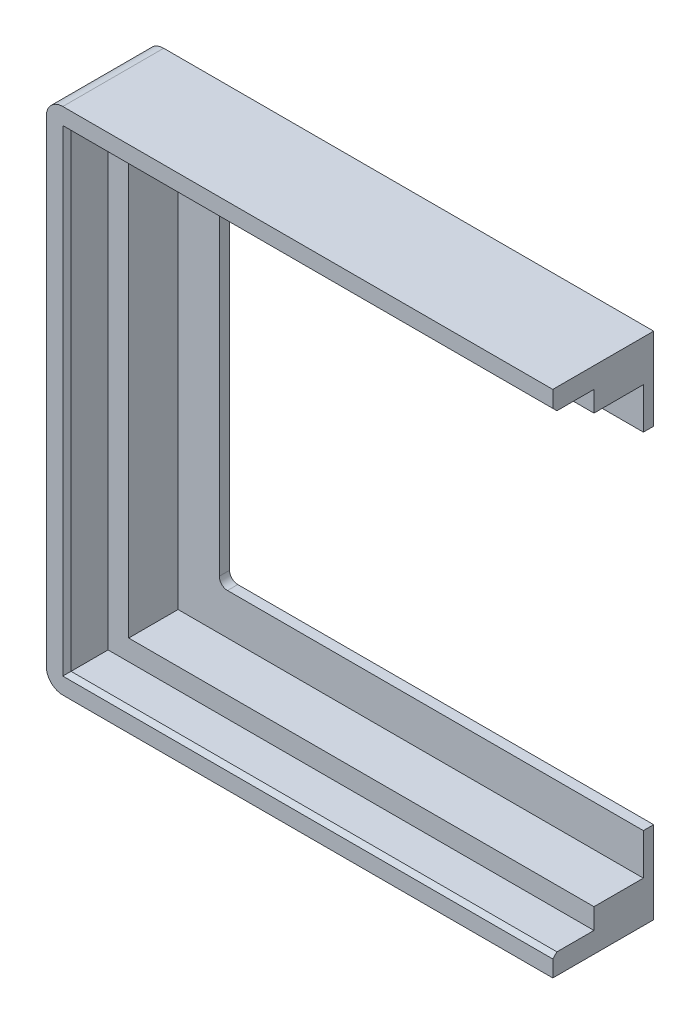
ISO-10303-21;
HEADER;
FILE_DESCRIPTION(('STEP AP214'),'2;1');
FILE_NAME('part.step','',(''),(''),'','','');
FILE_SCHEMA(('AUTOMOTIVE_DESIGN { 1 0 10303 214 1 1 1 1 }'));
ENDSEC;
DATA;
#1=APPLICATION_CONTEXT('core data for automotive mechanical design processes');
#2=APPLICATION_PROTOCOL_DEFINITION('international standard','automotive_design',2000,#1);
#3=PRODUCT_CONTEXT('',#1,'mechanical');
#4=PRODUCT('Part','Part','',(#3));
#5=PRODUCT_RELATED_PRODUCT_CATEGORY('part','',(#4));
#6=PRODUCT_DEFINITION_FORMATION('','',#4);
#7=PRODUCT_DEFINITION_CONTEXT('part definition',#1,'design');
#8=PRODUCT_DEFINITION('design','',#6,#7);
#9=PRODUCT_DEFINITION_SHAPE('','',#8);
#10=(LENGTH_UNIT() NAMED_UNIT(*) SI_UNIT(.MILLI.,.METRE.));
#11=(NAMED_UNIT(*) PLANE_ANGLE_UNIT() SI_UNIT($,.RADIAN.));
#12=(NAMED_UNIT(*) SI_UNIT($,.STERADIAN.) SOLID_ANGLE_UNIT());
#13=UNCERTAINTY_MEASURE_WITH_UNIT(LENGTH_MEASURE(1.E-05),#10,'distance_accuracy_value','');
#14=(GEOMETRIC_REPRESENTATION_CONTEXT(3) GLOBAL_UNCERTAINTY_ASSIGNED_CONTEXT((#13)) GLOBAL_UNIT_ASSIGNED_CONTEXT((#10,
#11,#12)) REPRESENTATION_CONTEXT('',''));
#15=CARTESIAN_POINT('',(0.,0.,0.));
#16=DIRECTION('',(0.,0.,1.));
#17=DIRECTION('',(1.,0.,0.));
#18=AXIS2_PLACEMENT_3D('',#15,#16,#17);
#19=CARTESIAN_POINT('',(74.93,0.,12.7));
#20=DIRECTION('',(1.,0.,0.));
#21=DIRECTION('',(0.,0.,-1.));
#22=AXIS2_PLACEMENT_3D('',#19,#20,#21);
#23=PLANE('',#22);
#24=DIRECTION('',(0.,0.,-1.));
#25=VECTOR('',#24,1.);
#26=CARTESIAN_POINT('',(74.93,-72.263,12.7));
#27=LINE('',#26,#25);
#28=CARTESIAN_POINT('',(74.93,-72.263,11.43));
#29=VERTEX_POINT('',#28);
#30=CARTESIAN_POINT('',(74.93,-72.263,0.));
#31=VERTEX_POINT('',#30);
#32=EDGE_CURVE('E307',#29,#31,#27,.T.);
#33=ORIENTED_EDGE('',*,*,#32,.F.);
#34=DIRECTION('',(0.,-0.707106781186548,0.707106781186548));
#35=VECTOR('',#34,1.);
#36=CARTESIAN_POINT('',(74.93,-36.7665,-24.0665));
#37=LINE('',#36,#35);
#38=CARTESIAN_POINT('',(74.93,-73.533,12.7));
#39=VERTEX_POINT('',#38);
#40=EDGE_CURVE('E353',#29,#39,#37,.T.);
#41=ORIENTED_EDGE('',*,*,#40,.T.);
#42=DIRECTION('',(0.,-1.,0.));
#43=VECTOR('',#42,1.);
#44=CARTESIAN_POINT('',(74.93,0.,12.7));
#45=LINE('',#44,#43);
#46=CARTESIAN_POINT('',(74.93,-78.613,12.7));
#47=VERTEX_POINT('',#46);
#48=EDGE_CURVE('E282',#39,#47,#45,.T.);
#49=ORIENTED_EDGE('',*,*,#48,.T.);
#50=DIRECTION('',(0.,0.,-1.));
#51=VECTOR('',#50,1.);
#52=CARTESIAN_POINT('',(74.93,-78.613,12.7));
#53=LINE('',#52,#51);
#54=CARTESIAN_POINT('',(74.93,-78.613,-18.415));
#55=VERTEX_POINT('',#54);
#56=EDGE_CURVE('E211',#47,#55,#53,.T.);
#57=ORIENTED_EDGE('',*,*,#56,.T.);
#58=DIRECTION('',(0.,-1.,0.));
#59=VECTOR('',#58,1.);
#60=CARTESIAN_POINT('',(74.93,-53.213,-18.415));
#61=LINE('',#60,#59);
#62=CARTESIAN_POINT('',(74.93,-53.213,-18.415));
#63=VERTEX_POINT('',#62);
#64=EDGE_CURVE('E227',#63,#55,#61,.T.);
#65=ORIENTED_EDGE('',*,*,#64,.F.);
#66=DIRECTION('',(0.,0.,1.));
#67=VECTOR('',#66,1.);
#68=CARTESIAN_POINT('',(74.93,-53.213,-18.415));
#69=LINE('',#68,#67);
#70=CARTESIAN_POINT('',(74.93,-53.213,-15.24));
#71=VERTEX_POINT('',#70);
#72=EDGE_CURVE('E232',#63,#71,#69,.T.);
#73=ORIENTED_EDGE('',*,*,#72,.T.);
#74=DIRECTION('',(0.,-1.,0.));
#75=VECTOR('',#74,1.);
#76=CARTESIAN_POINT('',(74.93,-53.213,-15.24));
#77=LINE('',#76,#75);
#78=CARTESIAN_POINT('',(74.93,-65.913,-15.24));
#79=VERTEX_POINT('',#78);
#80=EDGE_CURVE('E243',#71,#79,#77,.T.);
#81=ORIENTED_EDGE('',*,*,#80,.T.);
#82=DIRECTION('',(0.,0.,1.));
#83=VECTOR('',#82,1.);
#84=CARTESIAN_POINT('',(74.93,-65.913,-15.24));
#85=LINE('',#84,#83);
#86=CARTESIAN_POINT('',(74.93,-65.913,0.));
#87=VERTEX_POINT('',#86);
#88=EDGE_CURVE('E260',#79,#87,#85,.T.);
#89=ORIENTED_EDGE('',*,*,#88,.T.);
#90=DIRECTION('',(0.,-1.,0.));
#91=VECTOR('',#90,1.);
#92=CARTESIAN_POINT('',(74.93,-65.913,0.));
#93=LINE('',#92,#91);
#94=EDGE_CURVE('E254',#87,#31,#93,.T.);
#95=ORIENTED_EDGE('',*,*,#94,.T.);
#96=EDGE_LOOP('',(#33,#41,#49,#57,#65,#73,#81,#89,#95));
#97=FACE_BOUND('',#96,.T.);
#98=ADVANCED_FACE('F41',(#97),#23,.T.);
#99=CARTESIAN_POINT('',(0.,-72.263,12.7));
#100=DIRECTION('',(0.,-1.,0.));
#101=DIRECTION('',(1.,0.,0.));
#102=AXIS2_PLACEMENT_3D('',#99,#100,#101);
#103=PLANE('',#102);
#104=DIRECTION('',(0.,0.,-1.));
#105=VECTOR('',#104,1.);
#106=CARTESIAN_POINT('',(-74.93,-72.263,12.7));
#107=LINE('',#106,#105);
#108=CARTESIAN_POINT('',(-74.93,-72.263,11.43));
#109=VERTEX_POINT('',#108);
#110=CARTESIAN_POINT('',(-74.93,-72.263,0.));
#111=VERTEX_POINT('',#110);
#112=EDGE_CURVE('E305',#109,#111,#107,.T.);
#113=ORIENTED_EDGE('',*,*,#112,.F.);
#114=DIRECTION('',(1.,0.,0.));
#115=VECTOR('',#114,1.);
#116=CARTESIAN_POINT('',(74.93,-72.263,11.43));
#117=LINE('',#116,#115);
#118=EDGE_CURVE('E351',#109,#29,#117,.T.);
#119=ORIENTED_EDGE('',*,*,#118,.T.);
#120=ORIENTED_EDGE('',*,*,#32,.T.);
#121=DIRECTION('',(-1.,0.,0.));
#122=VECTOR('',#121,1.);
#123=CARTESIAN_POINT('',(0.,-72.263,0.));
#124=LINE('',#123,#122);
#125=EDGE_CURVE('E281',#31,#111,#124,.T.);
#126=ORIENTED_EDGE('',*,*,#125,.T.);
#127=EDGE_LOOP('',(#113,#119,#120,#126));
#128=FACE_BOUND('',#127,.T.);
#129=ADVANCED_FACE('F383',(#128),#103,.F.);
#130=CARTESIAN_POINT('',(-74.9299999999999,0.,12.7));
#131=DIRECTION('',(-1.,0.,0.));
#132=DIRECTION('',(0.,-1.,0.));
#133=AXIS2_PLACEMENT_3D('',#130,#131,#132);
#134=PLANE('',#133);
#135=DIRECTION('',(0.,0.,-1.));
#136=VECTOR('',#135,1.);
#137=CARTESIAN_POINT('',(-74.9299999999999,72.263,12.7));
#138=LINE('',#137,#136);
#139=CARTESIAN_POINT('',(-74.9299999999999,72.263,11.43));
#140=VERTEX_POINT('',#139);
#141=CARTESIAN_POINT('',(-74.9299999999999,72.263,0.));
#142=VERTEX_POINT('',#141);
#143=EDGE_CURVE('E303',#140,#142,#138,.T.);
#144=ORIENTED_EDGE('',*,*,#143,.F.);
#145=DIRECTION('',(0.,-1.,0.));
#146=VECTOR('',#145,1.);
#147=CARTESIAN_POINT('',(-74.93,-72.263,11.43));
#148=LINE('',#147,#146);
#149=EDGE_CURVE('E355',#140,#109,#148,.T.);
#150=ORIENTED_EDGE('',*,*,#149,.T.);
#151=ORIENTED_EDGE('',*,*,#112,.T.);
#152=DIRECTION('',(0.,1.,0.));
#153=VECTOR('',#152,1.);
#154=CARTESIAN_POINT('',(-74.9299999999999,0.,0.));
#155=LINE('',#154,#153);
#156=EDGE_CURVE('E296',#111,#142,#155,.T.);
#157=ORIENTED_EDGE('',*,*,#156,.T.);
#158=EDGE_LOOP('',(#144,#150,#151,#157));
#159=FACE_BOUND('',#158,.T.);
#160=ADVANCED_FACE('F391',(#159),#134,.F.);
#161=CARTESIAN_POINT('',(0.,72.263,12.7));
#162=DIRECTION('',(0.,-1.,0.));
#163=DIRECTION('',(1.,0.,0.));
#164=AXIS2_PLACEMENT_3D('',#161,#162,#163);
#165=PLANE('',#164);
#166=DIRECTION('',(0.,0.,-1.));
#167=VECTOR('',#166,1.);
#168=CARTESIAN_POINT('',(74.93,72.263,12.7));
#169=LINE('',#168,#167);
#170=CARTESIAN_POINT('',(74.93,72.263,11.43));
#171=VERTEX_POINT('',#170);
#172=CARTESIAN_POINT('',(74.93,72.263,0.));
#173=VERTEX_POINT('',#172);
#174=EDGE_CURVE('E210',#171,#173,#169,.T.);
#175=ORIENTED_EDGE('',*,*,#174,.F.);
#176=DIRECTION('',(-1.,0.,0.));
#177=VECTOR('',#176,1.);
#178=CARTESIAN_POINT('',(0.,72.263,11.43));
#179=LINE('',#178,#177);
#180=EDGE_CURVE('E51',#171,#140,#179,.T.);
#181=ORIENTED_EDGE('',*,*,#180,.T.);
#182=ORIENTED_EDGE('',*,*,#143,.T.);
#183=DIRECTION('',(-1.,0.,0.));
#184=VECTOR('',#183,1.);
#185=CARTESIAN_POINT('',(0.,72.263,0.));
#186=LINE('',#185,#184);
#187=EDGE_CURVE('E285',#173,#142,#186,.T.);
#188=ORIENTED_EDGE('',*,*,#187,.F.);
#189=EDGE_LOOP('',(#175,#181,#182,#188));
#190=FACE_BOUND('',#189,.T.);
#191=ADVANCED_FACE('F392',(#190),#165,.T.);
#192=CARTESIAN_POINT('',(74.93,0.,12.7));
#193=DIRECTION('',(-1.,0.,0.));
#194=DIRECTION('',(0.,0.,1.));
#195=AXIS2_PLACEMENT_3D('',#192,#193,#194);
#196=PLANE('',#195);
#197=DIRECTION('',(0.,1.,0.));
#198=VECTOR('',#197,1.);
#199=CARTESIAN_POINT('',(74.93,0.,12.7));
#200=LINE('',#199,#198);
#201=CARTESIAN_POINT('',(74.93,73.533,12.7));
#202=VERTEX_POINT('',#201);
#203=CARTESIAN_POINT('',(74.93,78.613,12.7));
#204=VERTEX_POINT('',#203);
#205=EDGE_CURVE('E284',#202,#204,#200,.T.);
#206=ORIENTED_EDGE('',*,*,#205,.F.);
#207=DIRECTION('',(0.,0.707106781186548,0.707106781186548));
#208=VECTOR('',#207,1.);
#209=CARTESIAN_POINT('',(74.93,72.263,11.43));
#210=LINE('',#209,#208);
#211=EDGE_CURVE('E11',#202,#171,#210,.F.);
#212=ORIENTED_EDGE('',*,*,#211,.T.);
#213=ORIENTED_EDGE('',*,*,#174,.T.);
#214=DIRECTION('',(0.,-1.,0.));
#215=VECTOR('',#214,1.);
#216=CARTESIAN_POINT('',(74.93,78.613,0.));
#217=LINE('',#216,#215);
#218=CARTESIAN_POINT('',(74.93,65.913,0.));
#219=VERTEX_POINT('',#218);
#220=EDGE_CURVE('E249',#173,#219,#217,.T.);
#221=ORIENTED_EDGE('',*,*,#220,.T.);
#222=DIRECTION('',(0.,0.,1.));
#223=VECTOR('',#222,1.);
#224=CARTESIAN_POINT('',(74.93,65.913,-15.24));
#225=LINE('',#224,#223);
#226=CARTESIAN_POINT('',(74.93,65.913,-15.24));
#227=VERTEX_POINT('',#226);
#228=EDGE_CURVE('E278',#227,#219,#225,.T.);
#229=ORIENTED_EDGE('',*,*,#228,.F.);
#230=DIRECTION('',(0.,-1.,0.));
#231=VECTOR('',#230,1.);
#232=CARTESIAN_POINT('',(74.93,78.613,-15.24));
#233=LINE('',#232,#231);
#234=CARTESIAN_POINT('',(74.93,53.213,-15.24));
#235=VERTEX_POINT('',#234);
#236=EDGE_CURVE('E233',#227,#235,#233,.T.);
#237=ORIENTED_EDGE('',*,*,#236,.T.);
#238=DIRECTION('',(0.,0.,1.));
#239=VECTOR('',#238,1.);
#240=CARTESIAN_POINT('',(74.93,53.213,-18.415));
#241=LINE('',#240,#239);
#242=CARTESIAN_POINT('',(74.93,53.213,-18.415));
#243=VERTEX_POINT('',#242);
#244=EDGE_CURVE('E215',#243,#235,#241,.T.);
#245=ORIENTED_EDGE('',*,*,#244,.F.);
#246=DIRECTION('',(0.,-1.,0.));
#247=VECTOR('',#246,1.);
#248=CARTESIAN_POINT('',(74.93,78.613,-18.415));
#249=LINE('',#248,#247);
#250=CARTESIAN_POINT('',(74.93,78.613,-18.415));
#251=VERTEX_POINT('',#250);
#252=EDGE_CURVE('E196',#251,#243,#249,.T.);
#253=ORIENTED_EDGE('',*,*,#252,.F.);
#254=DIRECTION('',(0.,0.,-1.));
#255=VECTOR('',#254,1.);
#256=CARTESIAN_POINT('',(74.93,78.613,12.7));
#257=LINE('',#256,#255);
#258=EDGE_CURVE('E206',#204,#251,#257,.T.);
#259=ORIENTED_EDGE('',*,*,#258,.F.);
#260=EDGE_LOOP('',(#206,#212,#213,#221,#229,#237,#245,#253,#259));
#261=FACE_BOUND('',#260,.T.);
#262=ADVANCED_FACE('F213',(#261),#196,.F.);
#263=CARTESIAN_POINT('',(0.,78.613,12.7));
#264=DIRECTION('',(0.,-1.,0.));
#265=DIRECTION('',(1.,0.,0.));
#266=AXIS2_PLACEMENT_3D('',#263,#264,#265);
#267=PLANE('',#266);
#268=DIRECTION('',(1.,0.,0.));
#269=VECTOR('',#268,1.);
#270=CARTESIAN_POINT('',(-81.28,78.613,-18.415));
#271=LINE('',#270,#269);
#272=CARTESIAN_POINT('',(-76.2,78.613,-18.415));
#273=VERTEX_POINT('',#272);
#274=EDGE_CURVE('E190',#273,#251,#271,.T.);
#275=ORIENTED_EDGE('',*,*,#274,.F.);
#276=DIRECTION('',(0.,0.,-1.));
#277=VECTOR('',#276,1.);
#278=CARTESIAN_POINT('',(-76.2,78.613,12.7));
#279=LINE('',#278,#277);
#280=CARTESIAN_POINT('',(-76.2,78.613,12.7));
#281=VERTEX_POINT('',#280);
#282=EDGE_CURVE('E324',#273,#281,#279,.F.);
#283=ORIENTED_EDGE('',*,*,#282,.T.);
#284=DIRECTION('',(-1.,0.,0.));
#285=VECTOR('',#284,1.);
#286=CARTESIAN_POINT('',(0.,78.613,12.7));
#287=LINE('',#286,#285);
#288=EDGE_CURVE('E209',#204,#281,#287,.T.);
#289=ORIENTED_EDGE('',*,*,#288,.F.);
#290=ORIENTED_EDGE('',*,*,#258,.T.);
#291=EDGE_LOOP('',(#275,#283,#289,#290));
#292=FACE_BOUND('',#291,.T.);
#293=ADVANCED_FACE('F207',(#292),#267,.F.);
#294=CARTESIAN_POINT('',(-81.28,0.,12.7));
#295=DIRECTION('',(-1.,0.,0.));
#296=DIRECTION('',(0.,-1.,0.));
#297=AXIS2_PLACEMENT_3D('',#294,#295,#296);
#298=PLANE('',#297);
#299=DIRECTION('',(0.,1.,0.));
#300=VECTOR('',#299,1.);
#301=CARTESIAN_POINT('',(-81.28,78.613,-18.415));
#302=LINE('',#301,#300);
#303=CARTESIAN_POINT('',(-81.28,-73.533,-18.415));
#304=VERTEX_POINT('',#303);
#305=CARTESIAN_POINT('',(-81.28,73.533,-18.415));
#306=VERTEX_POINT('',#305);
#307=EDGE_CURVE('E202',#304,#306,#302,.T.);
#308=ORIENTED_EDGE('',*,*,#307,.F.);
#309=DIRECTION('',(0.,0.,-1.));
#310=VECTOR('',#309,1.);
#311=CARTESIAN_POINT('',(-81.28,-73.533,12.7));
#312=LINE('',#311,#310);
#313=CARTESIAN_POINT('',(-81.28,-73.533,12.7));
#314=VERTEX_POINT('',#313);
#315=EDGE_CURVE('E318',#304,#314,#312,.F.);
#316=ORIENTED_EDGE('',*,*,#315,.T.);
#317=DIRECTION('',(0.,1.,0.));
#318=VECTOR('',#317,1.);
#319=CARTESIAN_POINT('',(-81.28,0.,12.7));
#320=LINE('',#319,#318);
#321=CARTESIAN_POINT('',(-81.28,73.533,12.7));
#322=VERTEX_POINT('',#321);
#323=EDGE_CURVE('E288',#314,#322,#320,.T.);
#324=ORIENTED_EDGE('',*,*,#323,.T.);
#325=DIRECTION('',(0.,0.,-1.));
#326=VECTOR('',#325,1.);
#327=CARTESIAN_POINT('',(-81.28,73.533,-18.415));
#328=LINE('',#327,#326);
#329=EDGE_CURVE('E315',#322,#306,#328,.T.);
#330=ORIENTED_EDGE('',*,*,#329,.T.);
#331=EDGE_LOOP('',(#308,#316,#324,#330));
#332=FACE_BOUND('',#331,.T.);
#333=ADVANCED_FACE('F439',(#332),#298,.T.);
#334=CARTESIAN_POINT('',(0.,-78.613,12.7));
#335=DIRECTION('',(0.,-1.,0.));
#336=DIRECTION('',(1.,0.,0.));
#337=AXIS2_PLACEMENT_3D('',#334,#335,#336);
#338=PLANE('',#337);
#339=DIRECTION('',(-1.,0.,0.));
#340=VECTOR('',#339,1.);
#341=CARTESIAN_POINT('',(0.,-78.613,12.7));
#342=LINE('',#341,#340);
#343=CARTESIAN_POINT('',(-76.1999999999999,-78.613,12.7));
#344=VERTEX_POINT('',#343);
#345=EDGE_CURVE('E291',#47,#344,#342,.T.);
#346=ORIENTED_EDGE('',*,*,#345,.T.);
#347=DIRECTION('',(0.,0.,-1.));
#348=VECTOR('',#347,1.);
#349=CARTESIAN_POINT('',(-76.1999999999999,-78.613,12.7));
#350=LINE('',#349,#348);
#351=CARTESIAN_POINT('',(-76.1999999999999,-78.613,-18.415));
#352=VERTEX_POINT('',#351);
#353=EDGE_CURVE('E309',#344,#352,#350,.T.);
#354=ORIENTED_EDGE('',*,*,#353,.T.);
#355=DIRECTION('',(-1.,0.,0.));
#356=VECTOR('',#355,1.);
#357=CARTESIAN_POINT('',(-81.28,-78.613,-18.415));
#358=LINE('',#357,#356);
#359=EDGE_CURVE('E230',#55,#352,#358,.T.);
#360=ORIENTED_EDGE('',*,*,#359,.F.);
#361=ORIENTED_EDGE('',*,*,#56,.F.);
#362=EDGE_LOOP('',(#346,#354,#360,#361));
#363=FACE_BOUND('',#362,.T.);
#364=ADVANCED_FACE('F431',(#363),#338,.T.);
#365=CARTESIAN_POINT('',(0.,0.,12.7));
#366=DIRECTION('',(0.,0.,1.));
#367=DIRECTION('',(1.,0.,0.));
#368=AXIS2_PLACEMENT_3D('',#365,#366,#367);
#369=PLANE('',#368);
#370=ORIENTED_EDGE('',*,*,#48,.F.);
#371=DIRECTION('',(-1.,0.,0.));
#372=VECTOR('',#371,1.);
#373=CARTESIAN_POINT('',(-74.93,-73.5330000000001,12.7));
#374=LINE('',#373,#372);
#375=CARTESIAN_POINT('',(-76.2,-73.5330000000001,12.7));
#376=VERTEX_POINT('',#375);
#377=EDGE_CURVE('E348',#39,#376,#374,.T.);
#378=ORIENTED_EDGE('',*,*,#377,.T.);
#379=DIRECTION('',(0.,1.,0.));
#380=VECTOR('',#379,1.);
#381=CARTESIAN_POINT('',(-76.2,72.263,12.7));
#382=LINE('',#381,#380);
#383=CARTESIAN_POINT('',(-76.2,73.533,12.7));
#384=VERTEX_POINT('',#383);
#385=EDGE_CURVE('E346',#376,#384,#382,.T.);
#386=ORIENTED_EDGE('',*,*,#385,.T.);
#387=DIRECTION('',(1.,0.,0.));
#388=VECTOR('',#387,1.);
#389=CARTESIAN_POINT('',(0.,73.533,12.7));
#390=LINE('',#389,#388);
#391=EDGE_CURVE('E344',#384,#202,#390,.T.);
#392=ORIENTED_EDGE('',*,*,#391,.T.);
#393=ORIENTED_EDGE('',*,*,#205,.T.);
#394=ORIENTED_EDGE('',*,*,#288,.T.);
#395=CARTESIAN_POINT('',(-76.2,73.533,12.7));
#396=DIRECTION('',(0.,0.,1.));
#397=DIRECTION('',(1.,0.,0.));
#398=AXIS2_PLACEMENT_3D('',#395,#396,#397);
#399=CIRCLE('',#398,5.08);
#400=EDGE_CURVE('E320',#281,#322,#399,.T.);
#401=ORIENTED_EDGE('',*,*,#400,.T.);
#402=ORIENTED_EDGE('',*,*,#323,.F.);
#403=CARTESIAN_POINT('',(-76.1999999999999,-73.533,12.7));
#404=DIRECTION('',(0.,0.,1.));
#405=DIRECTION('',(1.,0.,0.));
#406=AXIS2_PLACEMENT_3D('',#403,#404,#405);
#407=CIRCLE('',#406,5.08);
#408=EDGE_CURVE('E322',#314,#344,#407,.T.);
#409=ORIENTED_EDGE('',*,*,#408,.T.);
#410=ORIENTED_EDGE('',*,*,#345,.F.);
#411=EDGE_LOOP('',(#370,#378,#386,#392,#393,#394,#401,#402,#409,#410));
#412=FACE_BOUND('',#411,.T.);
#413=ADVANCED_FACE('F372',(#412),#369,.T.);
#414=CARTESIAN_POINT('',(74.93,65.913,-15.24));
#415=DIRECTION('',(0.,1.,0.));
#416=DIRECTION('',(0.,0.,1.));
#417=AXIS2_PLACEMENT_3D('',#414,#415,#416);
#418=PLANE('',#417);
#419=DIRECTION('',(-1.,0.,0.));
#420=VECTOR('',#419,1.);
#421=CARTESIAN_POINT('',(74.93,65.913,0.));
#422=LINE('',#421,#420);
#423=CARTESIAN_POINT('',(-68.58,65.913,0.));
#424=VERTEX_POINT('',#423);
#425=EDGE_CURVE('E262',#219,#424,#422,.T.);
#426=ORIENTED_EDGE('',*,*,#425,.T.);
#427=DIRECTION('',(0.,0.,1.));
#428=VECTOR('',#427,1.);
#429=CARTESIAN_POINT('',(-68.58,65.913,-15.24));
#430=LINE('',#429,#428);
#431=CARTESIAN_POINT('',(-68.58,65.913,-15.24));
#432=VERTEX_POINT('',#431);
#433=EDGE_CURVE('E275',#432,#424,#430,.T.);
#434=ORIENTED_EDGE('',*,*,#433,.F.);
#435=DIRECTION('',(-1.,0.,0.));
#436=VECTOR('',#435,1.);
#437=CARTESIAN_POINT('',(74.93,65.913,-15.24));
#438=LINE('',#437,#436);
#439=EDGE_CURVE('E250',#227,#432,#438,.T.);
#440=ORIENTED_EDGE('',*,*,#439,.F.);
#441=ORIENTED_EDGE('',*,*,#228,.T.);
#442=EDGE_LOOP('',(#426,#434,#440,#441));
#443=FACE_BOUND('',#442,.T.);
#444=ADVANCED_FACE('F396',(#443),#418,.F.);
#445=CARTESIAN_POINT('',(-68.58,65.913,-15.24));
#446=DIRECTION('',(-1.,0.,0.));
#447=DIRECTION('',(0.,-1.,0.));
#448=AXIS2_PLACEMENT_3D('',#445,#446,#447);
#449=PLANE('',#448);
#450=DIRECTION('',(0.,-1.,0.));
#451=VECTOR('',#450,1.);
#452=CARTESIAN_POINT('',(-68.58,65.913,0.));
#453=LINE('',#452,#451);
#454=CARTESIAN_POINT('',(-68.58,-65.913,0.));
#455=VERTEX_POINT('',#454);
#456=EDGE_CURVE('E264',#424,#455,#453,.T.);
#457=ORIENTED_EDGE('',*,*,#456,.T.);
#458=DIRECTION('',(0.,0.,1.));
#459=VECTOR('',#458,1.);
#460=CARTESIAN_POINT('',(-68.58,-65.913,-15.24));
#461=LINE('',#460,#459);
#462=CARTESIAN_POINT('',(-68.58,-65.913,-15.24));
#463=VERTEX_POINT('',#462);
#464=EDGE_CURVE('E272',#463,#455,#461,.T.);
#465=ORIENTED_EDGE('',*,*,#464,.F.);
#466=DIRECTION('',(0.,-1.,0.));
#467=VECTOR('',#466,1.);
#468=CARTESIAN_POINT('',(-68.58,65.913,-15.24));
#469=LINE('',#468,#467);
#470=EDGE_CURVE('E253',#432,#463,#469,.T.);
#471=ORIENTED_EDGE('',*,*,#470,.F.);
#472=ORIENTED_EDGE('',*,*,#433,.T.);
#473=EDGE_LOOP('',(#457,#465,#471,#472));
#474=FACE_BOUND('',#473,.T.);
#475=ADVANCED_FACE('F400',(#474),#449,.F.);
#476=CARTESIAN_POINT('',(74.93,-65.913,-15.24));
#477=DIRECTION('',(0.,-1.,0.));
#478=DIRECTION('',(0.,0.,-1.));
#479=AXIS2_PLACEMENT_3D('',#476,#477,#478);
#480=PLANE('',#479);
#481=DIRECTION('',(1.,0.,0.));
#482=VECTOR('',#481,1.);
#483=CARTESIAN_POINT('',(74.93,-65.913,0.));
#484=LINE('',#483,#482);
#485=EDGE_CURVE('E266',#455,#87,#484,.T.);
#486=ORIENTED_EDGE('',*,*,#485,.T.);
#487=ORIENTED_EDGE('',*,*,#88,.F.);
#488=DIRECTION('',(1.,0.,0.));
#489=VECTOR('',#488,1.);
#490=CARTESIAN_POINT('',(74.93,-65.913,-15.24));
#491=LINE('',#490,#489);
#492=EDGE_CURVE('E257',#463,#79,#491,.T.);
#493=ORIENTED_EDGE('',*,*,#492,.F.);
#494=ORIENTED_EDGE('',*,*,#464,.T.);
#495=EDGE_LOOP('',(#486,#487,#493,#494));
#496=FACE_BOUND('',#495,.T.);
#497=ADVANCED_FACE('F478',(#496),#480,.F.);
#498=CARTESIAN_POINT('',(0.,0.,0.));
#499=DIRECTION('',(0.,0.,1.));
#500=DIRECTION('',(1.,0.,0.));
#501=AXIS2_PLACEMENT_3D('',#498,#499,#500);
#502=PLANE('',#501);
#503=ORIENTED_EDGE('',*,*,#220,.F.);
#504=ORIENTED_EDGE('',*,*,#187,.T.);
#505=ORIENTED_EDGE('',*,*,#156,.F.);
#506=ORIENTED_EDGE('',*,*,#125,.F.);
#507=ORIENTED_EDGE('',*,*,#94,.F.);
#508=ORIENTED_EDGE('',*,*,#485,.F.);
#509=ORIENTED_EDGE('',*,*,#456,.F.);
#510=ORIENTED_EDGE('',*,*,#425,.F.);
#511=EDGE_LOOP('',(#503,#504,#505,#506,#507,#508,#509,#510));
#512=FACE_BOUND('',#511,.T.);
#513=ADVANCED_FACE('F387',(#512),#502,.T.);
#514=CARTESIAN_POINT('',(74.93,53.213,-18.415));
#515=DIRECTION('',(0.,1.,0.));
#516=DIRECTION('',(0.,0.,1.));
#517=AXIS2_PLACEMENT_3D('',#514,#515,#516);
#518=PLANE('',#517);
#519=DIRECTION('',(-1.,0.,0.));
#520=VECTOR('',#519,1.);
#521=CARTESIAN_POINT('',(74.93,53.213,-15.24));
#522=LINE('',#521,#520);
#523=CARTESIAN_POINT('',(-53.34,53.213,-15.24));
#524=VERTEX_POINT('',#523);
#525=EDGE_CURVE('E235',#235,#524,#522,.T.);
#526=ORIENTED_EDGE('',*,*,#525,.T.);
#527=DIRECTION('',(0.,0.,1.));
#528=VECTOR('',#527,1.);
#529=CARTESIAN_POINT('',(-53.34,53.213,-18.415));
#530=LINE('',#529,#528);
#531=CARTESIAN_POINT('',(-53.34,53.213,-18.415));
#532=VERTEX_POINT('',#531);
#533=EDGE_CURVE('E334',#524,#532,#530,.F.);
#534=ORIENTED_EDGE('',*,*,#533,.T.);
#535=DIRECTION('',(-1.,0.,0.));
#536=VECTOR('',#535,1.);
#537=CARTESIAN_POINT('',(74.93,53.213,-18.415));
#538=LINE('',#537,#536);
#539=EDGE_CURVE('E217',#243,#532,#538,.T.);
#540=ORIENTED_EDGE('',*,*,#539,.F.);
#541=ORIENTED_EDGE('',*,*,#244,.T.);
#542=EDGE_LOOP('',(#526,#534,#540,#541));
#543=FACE_BOUND('',#542,.T.);
#544=ADVANCED_FACE('F407',(#543),#518,.F.);
#545=CARTESIAN_POINT('',(-55.88,53.213,-18.415));
#546=DIRECTION('',(-1.,0.,0.));
#547=DIRECTION('',(0.,-1.,0.));
#548=AXIS2_PLACEMENT_3D('',#545,#546,#547);
#549=PLANE('',#548);
#550=DIRECTION('',(0.,-1.,0.));
#551=VECTOR('',#550,1.);
#552=CARTESIAN_POINT('',(-55.88,53.213,-15.24));
#553=LINE('',#552,#551);
#554=CARTESIAN_POINT('',(-55.88,50.673,-15.24));
#555=VERTEX_POINT('',#554);
#556=CARTESIAN_POINT('',(-55.88,-50.673,-15.24));
#557=VERTEX_POINT('',#556);
#558=EDGE_CURVE('E238',#555,#557,#553,.T.);
#559=ORIENTED_EDGE('',*,*,#558,.T.);
#560=DIRECTION('',(0.,0.,1.));
#561=VECTOR('',#560,1.);
#562=CARTESIAN_POINT('',(-55.88,-50.673,-18.415));
#563=LINE('',#562,#561);
#564=CARTESIAN_POINT('',(-55.88,-50.673,-18.415));
#565=VERTEX_POINT('',#564);
#566=EDGE_CURVE('E332',#557,#565,#563,.F.);
#567=ORIENTED_EDGE('',*,*,#566,.T.);
#568=DIRECTION('',(0.,-1.,0.));
#569=VECTOR('',#568,1.);
#570=CARTESIAN_POINT('',(-55.88,53.213,-18.415));
#571=LINE('',#570,#569);
#572=CARTESIAN_POINT('',(-55.88,50.673,-18.415));
#573=VERTEX_POINT('',#572);
#574=EDGE_CURVE('E219',#573,#565,#571,.T.);
#575=ORIENTED_EDGE('',*,*,#574,.F.);
#576=DIRECTION('',(0.,0.,1.));
#577=VECTOR('',#576,1.);
#578=CARTESIAN_POINT('',(-55.88,50.673,-15.24));
#579=LINE('',#578,#577);
#580=EDGE_CURVE('E329',#573,#555,#579,.T.);
#581=ORIENTED_EDGE('',*,*,#580,.T.);
#582=EDGE_LOOP('',(#559,#567,#575,#581));
#583=FACE_BOUND('',#582,.T.);
#584=ADVANCED_FACE('F416',(#583),#549,.F.);
#585=CARTESIAN_POINT('',(74.93,-53.213,-18.415));
#586=DIRECTION('',(0.,-1.,0.));
#587=DIRECTION('',(0.,0.,-1.));
#588=AXIS2_PLACEMENT_3D('',#585,#586,#587);
#589=PLANE('',#588);
#590=DIRECTION('',(1.,0.,0.));
#591=VECTOR('',#590,1.);
#592=CARTESIAN_POINT('',(74.93,-53.213,-18.415));
#593=LINE('',#592,#591);
#594=CARTESIAN_POINT('',(-53.34,-53.213,-18.415));
#595=VERTEX_POINT('',#594);
#596=EDGE_CURVE('E225',#595,#63,#593,.T.);
#597=ORIENTED_EDGE('',*,*,#596,.F.);
#598=DIRECTION('',(0.,0.,1.));
#599=VECTOR('',#598,1.);
#600=CARTESIAN_POINT('',(-53.34,-53.213,-15.24));
#601=LINE('',#600,#599);
#602=CARTESIAN_POINT('',(-53.34,-53.213,-15.24));
#603=VERTEX_POINT('',#602);
#604=EDGE_CURVE('E326',#595,#603,#601,.T.);
#605=ORIENTED_EDGE('',*,*,#604,.T.);
#606=DIRECTION('',(1.,0.,0.));
#607=VECTOR('',#606,1.);
#608=CARTESIAN_POINT('',(74.93,-53.213,-15.24));
#609=LINE('',#608,#607);
#610=EDGE_CURVE('E241',#603,#71,#609,.T.);
#611=ORIENTED_EDGE('',*,*,#610,.T.);
#612=ORIENTED_EDGE('',*,*,#72,.F.);
#613=EDGE_LOOP('',(#597,#605,#611,#612));
#614=FACE_BOUND('',#613,.T.);
#615=ADVANCED_FACE('F426',(#614),#589,.F.);
#616=CARTESIAN_POINT('',(0.,0.,-18.415));
#617=DIRECTION('',(0.,0.,1.));
#618=DIRECTION('',(1.,0.,0.));
#619=AXIS2_PLACEMENT_3D('',#616,#617,#618);
#620=PLANE('',#619);
#621=ORIENTED_EDGE('',*,*,#359,.T.);
#622=CARTESIAN_POINT('',(-76.1999999999999,-73.533,-18.415));
#623=DIRECTION('',(0.,0.,1.));
#624=DIRECTION('',(1.,0.,0.));
#625=AXIS2_PLACEMENT_3D('',#622,#623,#624);
#626=CIRCLE('',#625,5.08);
#627=EDGE_CURVE('E313',#352,#304,#626,.F.);
#628=ORIENTED_EDGE('',*,*,#627,.T.);
#629=ORIENTED_EDGE('',*,*,#307,.T.);
#630=CARTESIAN_POINT('',(-76.2,73.533,-18.415));
#631=DIRECTION('',(0.,0.,1.));
#632=DIRECTION('',(1.,0.,0.));
#633=AXIS2_PLACEMENT_3D('',#630,#631,#632);
#634=CIRCLE('',#633,5.08);
#635=EDGE_CURVE('E199',#306,#273,#634,.F.);
#636=ORIENTED_EDGE('',*,*,#635,.T.);
#637=ORIENTED_EDGE('',*,*,#274,.T.);
#638=ORIENTED_EDGE('',*,*,#252,.T.);
#639=ORIENTED_EDGE('',*,*,#539,.T.);
#640=CARTESIAN_POINT('',(-53.34,50.673,-18.415));
#641=DIRECTION('',(0.,0.,1.));
#642=DIRECTION('',(1.,0.,0.));
#643=AXIS2_PLACEMENT_3D('',#640,#641,#642);
#644=CIRCLE('',#643,2.54);
#645=EDGE_CURVE('E342',#532,#573,#644,.T.);
#646=ORIENTED_EDGE('',*,*,#645,.T.);
#647=ORIENTED_EDGE('',*,*,#574,.T.);
#648=CARTESIAN_POINT('',(-53.34,-50.673,-18.415));
#649=DIRECTION('',(0.,0.,1.));
#650=DIRECTION('',(1.,0.,0.));
#651=AXIS2_PLACEMENT_3D('',#648,#649,#650);
#652=CIRCLE('',#651,2.54);
#653=EDGE_CURVE('E338',#565,#595,#652,.T.);
#654=ORIENTED_EDGE('',*,*,#653,.T.);
#655=ORIENTED_EDGE('',*,*,#596,.T.);
#656=ORIENTED_EDGE('',*,*,#64,.T.);
#657=EDGE_LOOP('',(#621,#628,#629,#636,#637,#638,#639,#646,#647,#654,#655,#656));
#658=FACE_BOUND('',#657,.T.);
#659=ADVANCED_FACE('F193',(#658),#620,.F.);
#660=CARTESIAN_POINT('',(0.,0.,-15.24));
#661=DIRECTION('',(0.,0.,1.));
#662=DIRECTION('',(1.,0.,0.));
#663=AXIS2_PLACEMENT_3D('',#660,#661,#662);
#664=PLANE('',#663);
#665=ORIENTED_EDGE('',*,*,#236,.F.);
#666=ORIENTED_EDGE('',*,*,#439,.T.);
#667=ORIENTED_EDGE('',*,*,#470,.T.);
#668=ORIENTED_EDGE('',*,*,#492,.T.);
#669=ORIENTED_EDGE('',*,*,#80,.F.);
#670=ORIENTED_EDGE('',*,*,#610,.F.);
#671=CARTESIAN_POINT('',(-53.34,-50.673,-15.24));
#672=DIRECTION('',(0.,0.,1.));
#673=DIRECTION('',(1.,0.,0.));
#674=AXIS2_PLACEMENT_3D('',#671,#672,#673);
#675=CIRCLE('',#674,2.54);
#676=EDGE_CURVE('E336',#603,#557,#675,.F.);
#677=ORIENTED_EDGE('',*,*,#676,.T.);
#678=ORIENTED_EDGE('',*,*,#558,.F.);
#679=CARTESIAN_POINT('',(-53.34,50.673,-15.24));
#680=DIRECTION('',(0.,0.,1.));
#681=DIRECTION('',(1.,0.,0.));
#682=AXIS2_PLACEMENT_3D('',#679,#680,#681);
#683=CIRCLE('',#682,2.54);
#684=EDGE_CURVE('E340',#555,#524,#683,.F.);
#685=ORIENTED_EDGE('',*,*,#684,.T.);
#686=ORIENTED_EDGE('',*,*,#525,.F.);
#687=EDGE_LOOP('',(#665,#666,#667,#668,#669,#670,#677,#678,#685,#686));
#688=FACE_BOUND('',#687,.T.);
#689=ADVANCED_FACE('F404',(#688),#664,.T.);
#690=CARTESIAN_POINT('',(-76.1999999999999,-73.533,12.7));
#691=DIRECTION('',(0.,0.,-1.));
#692=DIRECTION('',(-1.,0.,0.));
#693=AXIS2_PLACEMENT_3D('',#690,#691,#692);
#694=CYLINDRICAL_SURFACE('',#693,5.08);
#695=ORIENTED_EDGE('',*,*,#408,.F.);
#696=ORIENTED_EDGE('',*,*,#315,.F.);
#697=ORIENTED_EDGE('',*,*,#627,.F.);
#698=ORIENTED_EDGE('',*,*,#353,.F.);
#699=EDGE_LOOP('',(#695,#696,#697,#698));
#700=FACE_BOUND('',#699,.T.);
#701=ADVANCED_FACE('F435',(#700),#694,.T.);
#702=CARTESIAN_POINT('',(-76.2,73.533,12.7));
#703=DIRECTION('',(0.,0.,1.));
#704=DIRECTION('',(1.,0.,0.));
#705=AXIS2_PLACEMENT_3D('',#702,#703,#704);
#706=CYLINDRICAL_SURFACE('',#705,5.08);
#707=ORIENTED_EDGE('',*,*,#400,.F.);
#708=ORIENTED_EDGE('',*,*,#282,.F.);
#709=ORIENTED_EDGE('',*,*,#635,.F.);
#710=ORIENTED_EDGE('',*,*,#329,.F.);
#711=EDGE_LOOP('',(#707,#708,#709,#710));
#712=FACE_BOUND('',#711,.T.);
#713=ADVANCED_FACE('F444',(#712),#706,.T.);
#714=CARTESIAN_POINT('',(-53.34,-50.673,-18.415));
#715=DIRECTION('',(0.,0.,-1.));
#716=DIRECTION('',(-1.,0.,0.));
#717=AXIS2_PLACEMENT_3D('',#714,#715,#716);
#718=CYLINDRICAL_SURFACE('',#717,2.54);
#719=ORIENTED_EDGE('',*,*,#653,.F.);
#720=ORIENTED_EDGE('',*,*,#566,.F.);
#721=ORIENTED_EDGE('',*,*,#676,.F.);
#722=ORIENTED_EDGE('',*,*,#604,.F.);
#723=EDGE_LOOP('',(#719,#720,#721,#722));
#724=FACE_BOUND('',#723,.T.);
#725=ADVANCED_FACE('F423',(#724),#718,.F.);
#726=CARTESIAN_POINT('',(-53.34,50.673,-18.415));
#727=DIRECTION('',(0.,0.,-1.));
#728=DIRECTION('',(-1.,0.,0.));
#729=AXIS2_PLACEMENT_3D('',#726,#727,#728);
#730=CYLINDRICAL_SURFACE('',#729,2.54);
#731=ORIENTED_EDGE('',*,*,#645,.F.);
#732=ORIENTED_EDGE('',*,*,#533,.F.);
#733=ORIENTED_EDGE('',*,*,#684,.F.);
#734=ORIENTED_EDGE('',*,*,#580,.F.);
#735=EDGE_LOOP('',(#731,#732,#733,#734));
#736=FACE_BOUND('',#735,.T.);
#737=ADVANCED_FACE('F413',(#736),#730,.F.);
#738=CARTESIAN_POINT('',(0.,72.263,11.43));
#739=DIRECTION('',(0.,0.707106781186548,-0.707106781186548));
#740=DIRECTION('',(-1.,0.,0.));
#741=AXIS2_PLACEMENT_3D('',#738,#739,#740);
#742=PLANE('',#741);
#743=ORIENTED_EDGE('',*,*,#211,.F.);
#744=ORIENTED_EDGE('',*,*,#391,.F.);
#745=DIRECTION('',(-0.577350269189626,0.577350269189626,0.577350269189626));
#746=VECTOR('',#745,1.);
#747=CARTESIAN_POINT('',(-51.689,49.022,-11.811));
#748=LINE('',#747,#746);
#749=EDGE_CURVE('E46',#140,#384,#748,.T.);
#750=ORIENTED_EDGE('',*,*,#749,.F.);
#751=ORIENTED_EDGE('',*,*,#180,.F.);
#752=EDGE_LOOP('',(#743,#744,#750,#751));
#753=FACE_BOUND('',#752,.T.);
#754=ADVANCED_FACE('F44',(#753),#742,.F.);
#755=CARTESIAN_POINT('',(-76.2,0.,12.7));
#756=DIRECTION('',(0.707106781186548,0.,0.707106781186548));
#757=DIRECTION('',(0.,-1.,0.));
#758=AXIS2_PLACEMENT_3D('',#755,#756,#757);
#759=PLANE('',#758);
#760=ORIENTED_EDGE('',*,*,#749,.T.);
#761=ORIENTED_EDGE('',*,*,#385,.F.);
#762=DIRECTION('',(0.577350269189626,0.577350269189626,-0.577350269189626));
#763=VECTOR('',#762,1.);
#764=CARTESIAN_POINT('',(-50.8,-48.1330000000001,-12.7));
#765=LINE('',#764,#763);
#766=EDGE_CURVE('E357',#109,#376,#765,.F.);
#767=ORIENTED_EDGE('',*,*,#766,.F.);
#768=ORIENTED_EDGE('',*,*,#149,.F.);
#769=EDGE_LOOP('',(#760,#761,#767,#768));
#770=FACE_BOUND('',#769,.T.);
#771=ADVANCED_FACE('F367',(#770),#759,.T.);
#772=CARTESIAN_POINT('',(0.,-73.533,12.7));
#773=DIRECTION('',(0.,0.707106781186548,0.707106781186548));
#774=DIRECTION('',(1.,0.,0.));
#775=AXIS2_PLACEMENT_3D('',#772,#773,#774);
#776=PLANE('',#775);
#777=ORIENTED_EDGE('',*,*,#40,.F.);
#778=ORIENTED_EDGE('',*,*,#118,.F.);
#779=ORIENTED_EDGE('',*,*,#766,.T.);
#780=ORIENTED_EDGE('',*,*,#377,.F.);
#781=EDGE_LOOP('',(#777,#778,#779,#780));
#782=FACE_BOUND('',#781,.T.);
#783=ADVANCED_FACE('F375',(#782),#776,.T.);
#784=CLOSED_SHELL('',(#98,#129,#160,#191,#262,#293,#333,#364,#413,#444,#475,#497,#513,#544,#584,
#615,#659,#689,#701,#713,#725,#737,#754,#771,#783));
#785=MANIFOLD_SOLID_BREP('B2',#784);
#786=ADVANCED_BREP_SHAPE_REPRESENTATION('',(#18,#785),#14);
#787=SHAPE_DEFINITION_REPRESENTATION(#9,#786);
ENDSEC;
END-ISO-10303-21;
